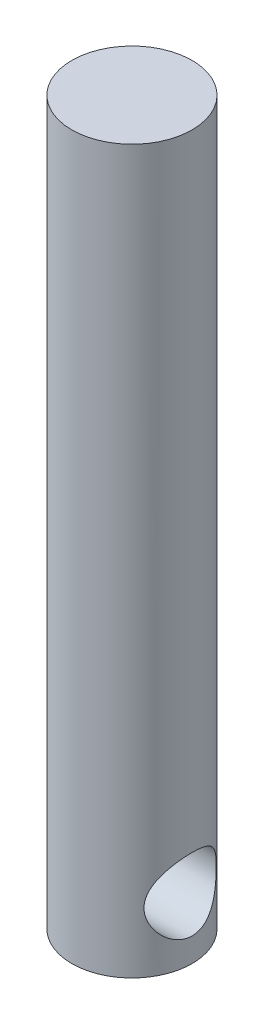
ISO-10303-21;
HEADER;
FILE_DESCRIPTION(('STEP AP214'),'2;1');
FILE_NAME('part.step','',(''),(''),'','','');
FILE_SCHEMA(('AUTOMOTIVE_DESIGN { 1 0 10303 214 1 1 1 1 }'));
ENDSEC;
DATA;
#1=APPLICATION_CONTEXT('core data for automotive mechanical design processes');
#2=APPLICATION_PROTOCOL_DEFINITION('international standard','automotive_design',2000,#1);
#3=PRODUCT_CONTEXT('',#1,'mechanical');
#4=PRODUCT('Part','Part','',(#3));
#5=PRODUCT_RELATED_PRODUCT_CATEGORY('part','',(#4));
#6=PRODUCT_DEFINITION_FORMATION('','',#4);
#7=PRODUCT_DEFINITION_CONTEXT('part definition',#1,'design');
#8=PRODUCT_DEFINITION('design','',#6,#7);
#9=PRODUCT_DEFINITION_SHAPE('','',#8);
#10=(LENGTH_UNIT() NAMED_UNIT(*) SI_UNIT(.MILLI.,.METRE.));
#11=(NAMED_UNIT(*) PLANE_ANGLE_UNIT() SI_UNIT($,.RADIAN.));
#12=(NAMED_UNIT(*) SI_UNIT($,.STERADIAN.) SOLID_ANGLE_UNIT());
#13=UNCERTAINTY_MEASURE_WITH_UNIT(LENGTH_MEASURE(1.E-05),#10,'distance_accuracy_value','');
#14=(GEOMETRIC_REPRESENTATION_CONTEXT(3) GLOBAL_UNCERTAINTY_ASSIGNED_CONTEXT((#13)) GLOBAL_UNIT_ASSIGNED_CONTEXT((#10,
#11,#12)) REPRESENTATION_CONTEXT('',''));
#15=CARTESIAN_POINT('',(0.,0.,0.));
#16=DIRECTION('',(0.,0.,1.));
#17=DIRECTION('',(1.,0.,0.));
#18=AXIS2_PLACEMENT_3D('',#15,#16,#17);
#19=CARTESIAN_POINT('',(0.,30.,0.));
#20=DIRECTION('',(0.,-1.,0.));
#21=DIRECTION('',(0.,0.,-1.));
#22=AXIS2_PLACEMENT_3D('',#19,#20,#21);
#23=CYLINDRICAL_SURFACE('',#22,2.5);
#24=CARTESIAN_POINT('',(-2.5,0.999999999999999,0.));
#25=CARTESIAN_POINT('',(-2.49999625789732,1.00000409100988,-0.0767298334620158));
#26=CARTESIAN_POINT('',(-2.4964290461501,1.00592867092626,-0.153582320644178));
#27=CARTESIAN_POINT('',(-2.48249903608568,1.02932431951533,-0.304975509530679));
#28=CARTESIAN_POINT('',(-2.47211948032719,1.04682386185422,-0.379510034596047));
#29=CARTESIAN_POINT('',(-2.44561558054488,1.09238636116686,-0.523751827790837));
#30=CARTESIAN_POINT('',(-2.42951973272944,1.12039695816316,-0.593481028226566));
#31=CARTESIAN_POINT('',(-2.39295367626407,1.18586033314103,-0.727030318214659));
#32=CARTESIAN_POINT('',(-2.37248455380255,1.22331076696874,-0.790851869416383));
#33=CARTESIAN_POINT('',(-2.32705360719088,1.30977482670858,-0.916299278999315));
#34=CARTESIAN_POINT('',(-2.30186792195985,1.35945369535139,-0.977384020081415));
#35=CARTESIAN_POINT('',(-2.25030439279634,1.46746720382827,-1.09088270411891));
#36=CARTESIAN_POINT('',(-2.22392505153571,1.52581293718732,-1.14328534948112));
#37=CARTESIAN_POINT('',(-2.1691106699591,1.65792351049673,-1.24444996762974));
#38=CARTESIAN_POINT('',(-2.14082017703649,1.73270177098129,-1.29197766378809));
#39=CARTESIAN_POINT('',(-2.08938301412124,1.89084657324311,-1.37361437764896));
#40=CARTESIAN_POINT('',(-2.06622802273937,1.97419889624757,-1.4077451733516));
#41=CARTESIAN_POINT('',(-2.0335462966093,2.12659645065324,-1.45440601714222));
#42=CARTESIAN_POINT('',(-2.02207883137591,2.19423599861032,-1.47016197246827));
#43=CARTESIAN_POINT('',(-2.00590308295503,2.33180371583036,-1.49216172340475));
#44=CARTESIAN_POINT('',(-2.00118639643759,2.40172892875449,-1.49841734556836));
#45=CARTESIAN_POINT('',(-1.99920922463856,2.54201149421733,-1.50105508796009));
#46=CARTESIAN_POINT('',(-2.00196337012718,2.6123694250932,-1.49741783408419));
#47=CARTESIAN_POINT('',(-2.01453261443741,2.75127877542759,-1.48046060478828));
#48=CARTESIAN_POINT('',(-2.02435302432226,2.81982879584744,-1.46713334620103));
#49=CARTESIAN_POINT('',(-2.04953186944258,2.9525302421281,-1.43173921881792));
#50=CARTESIAN_POINT('',(-2.06481711652537,3.01672705392448,-1.40978748666087));
#51=CARTESIAN_POINT('',(-2.09927051350828,3.14069499092812,-1.35795061770837));
#52=CARTESIAN_POINT('',(-2.11844008623465,3.20046448342392,-1.32806257259705));
#53=CARTESIAN_POINT('',(-2.16255327268985,3.3249840971228,-1.25517983184583));
#54=CARTESIAN_POINT('',(-2.18792043372992,3.38877809295493,-1.21080724397723));
#55=CARTESIAN_POINT('',(-2.23930599764381,3.50867648366701,-1.11291092784003));
#56=CARTESIAN_POINT('',(-2.26532500262149,3.56477343397651,-1.05937845100579));
#57=CARTESIAN_POINT('',(-2.31935504958317,3.67561298182176,-0.935811834382968));
#58=CARTESIAN_POINT('',(-2.34713836268532,3.72907730601599,-0.864517682704959));
#59=CARTESIAN_POINT('',(-2.3977242843398,3.82312204719791,-0.712276050459002));
#60=CARTESIAN_POINT('',(-2.42052955425515,3.86370935378995,-0.631333763943566));
#61=CARTESIAN_POINT('',(-2.45730392066151,3.9279321827959,-0.467197585268209));
#62=CARTESIAN_POINT('',(-2.47173957439704,3.95247535571591,-0.384467624173582));
#63=CARTESIAN_POINT('',(-2.4921884281355,3.98701119740538,-0.215047895144642));
#64=CARTESIAN_POINT('',(-2.49821172952738,3.99702131775358,-0.128363005661321));
#65=CARTESIAN_POINT('',(-2.5009057037461,4.00150784767831,0.0337146143773941));
#66=CARTESIAN_POINT('',(-2.49873521714286,3.99790885508517,0.109042473418716));
#67=CARTESIAN_POINT('',(-2.48778712087048,3.97957414692808,0.257829401986058));
#68=CARTESIAN_POINT('',(-2.47900964518037,3.96483865719419,0.331288509376104));
#69=CARTESIAN_POINT('',(-2.4559479244219,3.92545656718754,0.472574932157611));
#70=CARTESIAN_POINT('',(-2.44180275662555,3.90105965092653,0.540495750928482));
#71=CARTESIAN_POINT('',(-2.40913880862844,3.84332262363473,0.671265749087261));
#72=CARTESIAN_POINT('',(-2.39061916586511,3.80998074865333,0.734113924963907));
#73=CARTESIAN_POINT('',(-2.3484549623736,3.7314430207913,0.860006262823862));
#74=CARTESIAN_POINT('',(-2.3244780273988,3.68537617092161,0.922394150456836));
#75=CARTESIAN_POINT('',(-2.27474265574732,3.58460860651139,1.03902603131014));
#76=CARTESIAN_POINT('',(-2.2489821658636,3.52989784514747,1.09326040273738));
#77=CARTESIAN_POINT('',(-2.19445423909891,3.40508960996285,1.19931996735579));
#78=CARTESIAN_POINT('',(-2.16573241746291,3.3339161145345,1.24991019630915));
#79=CARTESIAN_POINT('',(-2.1121618206671,3.1827839754318,1.33845238915667));
#80=CARTESIAN_POINT('',(-2.0873089799769,3.10283470610722,1.37641766769781));
#81=CARTESIAN_POINT('',(-2.04984909240519,2.95375697769331,1.43142578795776));
#82=CARTESIAN_POINT('',(-2.03575659328729,2.88601968764141,1.4512162533619));
#83=CARTESIAN_POINT('',(-2.01409605743544,2.7474679219199,1.48113663905972));
#84=CARTESIAN_POINT('',(-2.00651897642721,2.67665785567217,1.49127995297631));
#85=CARTESIAN_POINT('',(-1.99900446616267,2.53362305240297,1.50134130416631));
#86=CARTESIAN_POINT('',(-1.99909576445937,2.46139400931296,1.50122089107869));
#87=CARTESIAN_POINT('',(-2.0069771789285,2.31810556439054,1.49066472959328));
#88=CARTESIAN_POINT('',(-2.0147714813882,2.24704681991941,1.48022337215759));
#89=CARTESIAN_POINT('',(-2.0363318524298,2.11151158242781,1.45040174148913));
#90=CARTESIAN_POINT('',(-2.0497921180558,2.04688290569313,1.43147636845351));
#91=CARTESIAN_POINT('',(-2.08105501960151,1.92166274552579,1.38563242076993));
#92=CARTESIAN_POINT('',(-2.09885929040482,1.86107279303945,1.3587108358848));
#93=CARTESIAN_POINT('',(-2.14012990550916,1.73568014277922,1.29289245555733));
#94=CARTESIAN_POINT('',(-2.16404587582639,1.67165889614569,1.25279167675753));
#95=CARTESIAN_POINT('',(-2.21320127030768,1.55061992738271,1.16375698389085));
#96=CARTESIAN_POINT('',(-2.23844177205021,1.49360803784745,1.11481579607798));
#97=CARTESIAN_POINT('',(-2.29225690291476,1.37864905086833,1.00009777425734));
#98=CARTESIAN_POINT('',(-2.32070308663658,1.32206892510381,0.932876819313907));
#99=CARTESIAN_POINT('',(-2.37365428872367,1.22090214413669,0.788462434445592));
#100=CARTESIAN_POINT('',(-2.39815789310935,1.17631978801521,0.711265444501543));
#101=CARTESIAN_POINT('',(-2.43985578654394,1.10221419242626,0.551125230801457));
#102=CARTESIAN_POINT('',(-2.45725077479787,1.07227193507317,0.468430086957218));
#103=CARTESIAN_POINT('',(-2.48366273001246,1.02727530478902,0.297973306118812));
#104=CARTESIAN_POINT('',(-2.49271125871485,1.01216483214301,0.210232099648616));
#105=CARTESIAN_POINT('',(-2.49802001168187,1.00330254529134,0.101558096917538));
#106=CARTESIAN_POINT('',(-2.49876114656362,1.0020655826939,0.0812762590282788));
#107=CARTESIAN_POINT('',(-2.49975164517367,1.00041375362914,0.0406658206871127));
#108=CARTESIAN_POINT('',(-2.50000099184316,0.999998915679095,0.0203372186375696));
#109=CARTESIAN_POINT('',(-2.5,0.999999999999999,0.));
#110=B_SPLINE_CURVE_WITH_KNOTS('',3,(#24,#25,#26,#27,#28,#29,#30,#31,#32,#33,#34,#35,#36,#37,
#38,#39,#40,#41,#42,#43,#44,#45,#46,#47,#48,#49,#50,#51,#52,#53,#54,#55,#56,#57,#58,#59,#60,#61,
#62,#63,#64,#65,#66,#67,#68,#69,#70,#71,#72,#73,#74,#75,#76,#77,#78,#79,#80,#81,#82,#83,#84,#85,
#86,#87,#88,#89,#90,#91,#92,#93,#94,#95,#96,#97,#98,#99,#100,#101,#102,#103,#104,#105,#106,#107,
#108,#109),.UNSPECIFIED.,.T.,.F.,(4,2,2,2,2,2,2,2,2,2,2,2,2,2,2,2,2,2,2,2,2,2,2,2,2,2,2,2,2,2,2,
2,2,2,2,2,2,2,2,2,2,2,4),(0.,0.230102237548649,0.460772627520012,0.690308884600012,
0.919788197992275,1.16681590732473,1.414162579348,1.69183813189807,1.96906040692092,
2.17933829855633,2.38935420916578,2.59978170870726,2.81036753273872,3.01823267593207,
3.22617409809868,3.47046995225163,3.71500044803674,3.99360957884691,4.27206939275324,
4.53296790696559,4.79355286918236,5.01875602722426,5.24395461863455,5.46367785689772,
5.68344445659025,5.92601365818362,6.16886690081836,6.44336762428009,6.71757792616456,
6.93257787314692,7.14727888733318,7.36278425777433,7.57840681155725,7.78364098331142,
7.98895251523035,8.22578610052286,8.46281544370208,8.73854311775519,9.01436946031985,
9.28175654462677,9.54812832184448,9.60911473335177,9.67010326027641),.UNSPECIFIED.);
#111=CARTESIAN_POINT('',(-2.5,0.999999999999999,0.));
#112=VERTEX_POINT('',#111);
#113=EDGE_CURVE('E10',#112,#112,#110,.T.);
#114=ORIENTED_EDGE('',*,*,#113,.T.);
#115=EDGE_LOOP('',(#114));
#116=FACE_BOUND('',#115,.T.);
#117=CARTESIAN_POINT('',(2.,2.5,-1.5));
#118=CARTESIAN_POINT('',(1.99999416642511,2.42452102471036,-1.50000404108592));
#119=CARTESIAN_POINT('',(2.00433633903481,2.3490615659202,-1.49426852824014));
#120=CARTESIAN_POINT('',(2.02092590613883,2.20067609603778,-1.47174965152787));
#121=CARTESIAN_POINT('',(2.03318155043097,2.1277528126149,-1.45495475788936));
#122=CARTESIAN_POINT('',(2.0636233903473,1.98691635832272,-1.41143486335796));
#123=CARTESIAN_POINT('',(2.08176666183119,1.91897116196473,-1.3847815450315));
#124=CARTESIAN_POINT('',(2.12185904995836,1.78856254663208,-1.3225290928302));
#125=CARTESIAN_POINT('',(2.14380930122416,1.72610077030486,-1.28692729054694));
#126=CARTESIAN_POINT('',(2.19228594587542,1.60005098333592,-1.20271292747644));
#127=CARTESIAN_POINT('',(2.21904371037662,1.53725904287606,-1.15304179435289));
#128=CARTESIAN_POINT('',(2.2722622943106,1.42023523725825,-1.04426801309985));
#129=CARTESIAN_POINT('',(2.29872287517103,1.3660098483292,-0.985158296729614));
#130=CARTESIAN_POINT('',(2.35175567858734,1.2618661902903,-0.851442367411703));
#131=CARTESIAN_POINT('',(2.37803133577818,1.21304553633025,-0.775851995162549));
#132=CARTESIAN_POINT('',(2.42443786983179,1.12919027755557,-0.615654228271659));
#133=CARTESIAN_POINT('',(2.44457437988735,1.09414302587729,-0.531055196626331));
#134=CARTESIAN_POINT('',(2.4747098780044,1.04240407718735,-0.363771406742667));
#135=CARTESIAN_POINT('',(2.4854930393917,1.0242796390327,-0.281674698130916));
#136=CARTESIAN_POINT('',(2.49874939277545,1.00205719713688,-0.114970509382708));
#137=CARTESIAN_POINT('',(2.50123038813307,0.997946021999945,-0.0303654624001536));
#138=CARTESIAN_POINT('',(2.49783372711539,1.00361374734246,0.12763728373731));
#139=CARTESIAN_POINT('',(2.49295437513726,1.01173352616931,0.201123832865634));
#140=CARTESIAN_POINT('',(2.47707997553857,1.03847979564811,0.345464269151768));
#141=CARTESIAN_POINT('',(2.46608447529309,1.05710706390715,0.416317961051202));
#142=CARTESIAN_POINT('',(2.43884907201719,1.10416556270378,0.55405678046908));
#143=CARTESIAN_POINT('',(2.42257910450824,1.132653061139,0.620916491037618));
#144=CARTESIAN_POINT('',(2.38609637638748,1.19838461622554,0.748988660115611));
#145=CARTESIAN_POINT('',(2.36588259201812,1.23563094705901,0.810199646208011));
#146=CARTESIAN_POINT('',(2.32037925976362,1.32283909280445,0.9330742671432));
#147=CARTESIAN_POINT('',(2.2947718295215,1.37378831173574,0.993918663198194));
#148=CARTESIAN_POINT('',(2.24255554245601,1.48440411786017,1.10671465909275));
#149=CARTESIAN_POINT('',(2.21594536703375,1.54408250347451,1.1586540130834));
#150=CARTESIAN_POINT('',(2.16111075123946,1.67865340616355,1.25824837767417));
#151=CARTESIAN_POINT('',(2.13305661385124,1.75450757653946,1.30470933188632));
#152=CARTESIAN_POINT('',(2.08250879557267,1.91470623163661,1.38397217194232));
#153=CARTESIAN_POINT('',(2.0600049029882,1.99903471612564,1.41679921962189));
#154=CARTESIAN_POINT('',(2.02895865196731,2.15239363189535,1.46077497064843));
#155=CARTESIAN_POINT('',(2.01833888618315,2.22004063229664,1.47527903312665));
#156=CARTESIAN_POINT('',(2.00392150777558,2.35737361029948,1.49480872755284));
#157=CARTESIAN_POINT('',(2.00011596115116,2.42705712048456,1.49984538302907));
#158=CARTESIAN_POINT('',(1.99988914321323,2.56655168243571,1.50014781114183));
#159=CARTESIAN_POINT('',(2.00347810223984,2.63636277721521,1.49540004697659));
#160=CARTESIAN_POINT('',(2.01751520788652,2.77398734374856,1.47640290574941));
#161=CARTESIAN_POINT('',(2.02796877613213,2.84179919224025,1.4621460183014));
#162=CARTESIAN_POINT('',(2.054317683331,2.97371457947979,1.42488312618657));
#163=CARTESIAN_POINT('',(2.07020622092812,3.03782263653223,1.40188805257362));
#164=CARTESIAN_POINT('',(2.10571539417587,3.16147771573018,1.34796261057072));
#165=CARTESIAN_POINT('',(2.12533743689999,3.221023006366,1.31702924888212));
#166=CARTESIAN_POINT('',(2.17036819177736,3.34524008251225,1.24167439558512));
#167=CARTESIAN_POINT('',(2.19618239397369,3.40890083509657,1.19582663060303));
#168=CARTESIAN_POINT('',(2.2482175480362,3.52828548484946,1.09487395518701));
#169=CARTESIAN_POINT('',(2.27443886711455,3.58400169216912,1.03976018672402));
#170=CARTESIAN_POINT('',(2.32835625910913,3.69322400735043,0.913274837212767));
#171=CARTESIAN_POINT('',(2.3558007587587,3.74550072660584,0.840721108780191));
#172=CARTESIAN_POINT('',(2.40537639133459,3.83690277683666,0.686103100868019));
#173=CARTESIAN_POINT('',(2.4275110444941,3.87603682784092,0.604045176134702));
#174=CARTESIAN_POINT('',(2.46252280092775,3.93686820343137,0.438840232972138));
#175=CARTESIAN_POINT('',(2.47595588067329,3.95962622779111,0.356205963651258));
#176=CARTESIAN_POINT('',(2.494407389061,3.99071460284626,0.187383063890857));
#177=CARTESIAN_POINT('',(2.49943534582737,3.99906129071763,0.101198571781968));
#178=CARTESIAN_POINT('',(2.50040600461976,4.00067460858593,-0.0598120232009843));
#179=CARTESIAN_POINT('',(2.49747057186327,3.99580333456303,-0.134620583589707));
#180=CARTESIAN_POINT('',(2.48512948412095,3.97510617561839,-0.282148755978774));
#181=CARTESIAN_POINT('',(2.47572375706639,3.9592801686784,-0.354868344701914));
#182=CARTESIAN_POINT('',(2.45149427526962,3.91778042841622,-0.495145481978797));
#183=CARTESIAN_POINT('',(2.43675966858906,3.89226840387076,-0.56276703260883));
#184=CARTESIAN_POINT('',(2.40303337447155,3.83235940544525,-0.692781971999984));
#185=CARTESIAN_POINT('',(2.38404073252268,3.7979604391404,-0.755174184199832));
#186=CARTESIAN_POINT('',(2.3409343265938,3.71707480343124,-0.880263645295948));
#187=CARTESIAN_POINT('',(2.31648844639149,3.66968129098313,-0.94225869043994));
#188=CARTESIAN_POINT('',(2.26601907350661,3.56624696628228,-1.05789751536307));
#189=CARTESIAN_POINT('',(2.23999385274509,3.51019657439209,-1.11153190956916));
#190=CARTESIAN_POINT('',(2.18528165666204,3.3827144378223,-1.2159097535057));
#191=CARTESIAN_POINT('',(2.15667566270901,3.3102335138345,-1.26542406663368));
#192=CARTESIAN_POINT('',(2.10376464485145,3.15651514723346,-1.35156817210325));
#193=CARTESIAN_POINT('',(2.07945738811052,3.07528228601859,-1.38820466322661));
#194=CARTESIAN_POINT('',(2.0408000304796,2.9129357148628,-1.44437116535132));
#195=CARTESIAN_POINT('',(2.02577665830138,2.83240476403875,-1.46509526060187));
#196=CARTESIAN_POINT('',(2.00539032320036,2.66790260529632,-1.49289268240426));
#197=CARTESIAN_POINT('',(2.00000648744643,2.58393923424129,-1.49999550595837));
#198=CARTESIAN_POINT('',(2.,2.5,-1.5));
#199=B_SPLINE_CURVE_WITH_KNOTS('',3,(#117,#118,#119,#120,#121,#122,#123,#124,#125,#126,#127,
#128,#129,#130,#131,#132,#133,#134,#135,#136,#137,#138,#139,#140,#141,#142,#143,#144,#145,#146,
#147,#148,#149,#150,#151,#152,#153,#154,#155,#156,#157,#158,#159,#160,#161,#162,#163,#164,#165,
#166,#167,#168,#169,#170,#171,#172,#173,#174,#175,#176,#177,#178,#179,#180,#181,#182,#183,#184,
#185,#186,#187,#188,#189,#190,#191,#192,#193,#194,#195,#196,#197,#198),.UNSPECIFIED.,.T.,.F.,(4,
2,2,2,2,2,2,2,2,2,2,2,2,2,2,2,2,2,2,2,2,2,2,2,2,2,2,2,2,2,2,2,2,2,2,2,2,2,2,2,4),(0.,
0.226085249493392,0.45240657433077,0.677113624991876,0.901887762215932,1.15414462390001,
1.40659128601844,1.68630157736223,1.9657544327122,2.21853330858497,2.47107452602767,
2.69230130543182,2.91354445887945,3.13607155036377,3.35865648368878,3.60782810055849,
3.85733966656908,4.13576671140276,4.41367760154768,4.62276298054684,4.83160475643977,
5.04073566011182,5.25003193304128,5.45906724365495,5.66818149154661,5.91499438482003,
6.16204457978455,6.44121828011589,6.72020638384848,6.97891479383338,7.23732973022727,
7.461293218494,7.68525920139649,7.90563970188757,8.12606965394585,8.37042963549488,
8.61506198741955,8.89071695766605,9.16622832484806,9.41820120134355,9.66962780912278),.UNSPECIFIED.);
#200=CARTESIAN_POINT('',(2.,2.5,-1.5));
#201=VERTEX_POINT('',#200);
#202=EDGE_CURVE('E43',#201,#201,#199,.T.);
#203=ORIENTED_EDGE('',*,*,#202,.T.);
#204=EDGE_LOOP('',(#203));
#205=FACE_BOUND('',#204,.T.);
#206=CARTESIAN_POINT('',(0.,30.,0.));
#207=DIRECTION('',(0.,1.,0.));
#208=DIRECTION('',(0.,0.,1.));
#209=AXIS2_PLACEMENT_3D('',#206,#207,#208);
#210=CIRCLE('',#209,2.5);
#211=CARTESIAN_POINT('',(0.,30.,2.5));
#212=VERTEX_POINT('',#211);
#213=EDGE_CURVE('E47',#212,#212,#210,.T.);
#214=ORIENTED_EDGE('',*,*,#213,.F.);
#215=EDGE_LOOP('',(#214));
#216=FACE_BOUND('',#215,.T.);
#217=CARTESIAN_POINT('',(0.,0.,0.));
#218=DIRECTION('',(0.,1.,0.));
#219=DIRECTION('',(0.,0.,1.));
#220=AXIS2_PLACEMENT_3D('',#217,#218,#219);
#221=CIRCLE('',#220,2.5);
#222=CARTESIAN_POINT('',(0.,0.,2.5));
#223=VERTEX_POINT('',#222);
#224=EDGE_CURVE('E51',#223,#223,#221,.T.);
#225=ORIENTED_EDGE('',*,*,#224,.T.);
#226=EDGE_LOOP('',(#225));
#227=FACE_BOUND('',#226,.T.);
#228=ADVANCED_FACE('F32',(#116,#205,#216,#227),#23,.T.);
#229=CARTESIAN_POINT('',(0.,30.,0.));
#230=DIRECTION('',(0.,1.,0.));
#231=DIRECTION('',(0.,0.,1.));
#232=AXIS2_PLACEMENT_3D('',#229,#230,#231);
#233=PLANE('',#232);
#234=ORIENTED_EDGE('',*,*,#213,.T.);
#235=EDGE_LOOP('',(#234));
#236=FACE_BOUND('',#235,.T.);
#237=ADVANCED_FACE('F63',(#236),#233,.T.);
#238=CARTESIAN_POINT('',(0.,0.,0.));
#239=DIRECTION('',(0.,1.,0.));
#240=DIRECTION('',(0.,0.,1.));
#241=AXIS2_PLACEMENT_3D('',#238,#239,#240);
#242=PLANE('',#241);
#243=ORIENTED_EDGE('',*,*,#224,.F.);
#244=EDGE_LOOP('',(#243));
#245=FACE_BOUND('',#244,.T.);
#246=ADVANCED_FACE('F61',(#245),#242,.F.);
#247=CARTESIAN_POINT('',(-2.5,2.5,0.));
#248=DIRECTION('',(1.,0.,0.));
#249=DIRECTION('',(0.,0.,-1.));
#250=AXIS2_PLACEMENT_3D('',#247,#248,#249);
#251=CYLINDRICAL_SURFACE('',#250,1.5);
#252=ORIENTED_EDGE('',*,*,#202,.F.);
#253=EDGE_LOOP('',(#252));
#254=FACE_BOUND('',#253,.T.);
#255=ORIENTED_EDGE('',*,*,#113,.F.);
#256=EDGE_LOOP('',(#255));
#257=FACE_BOUND('',#256,.T.);
#258=ADVANCED_FACE('F57',(#254,#257),#251,.F.);
#259=CLOSED_SHELL('',(#228,#237,#246,#258));
#260=MANIFOLD_SOLID_BREP('B2',#259);
#261=ADVANCED_BREP_SHAPE_REPRESENTATION('',(#18,#260),#14);
#262=SHAPE_DEFINITION_REPRESENTATION(#9,#261);
ENDSEC;
END-ISO-10303-21;
